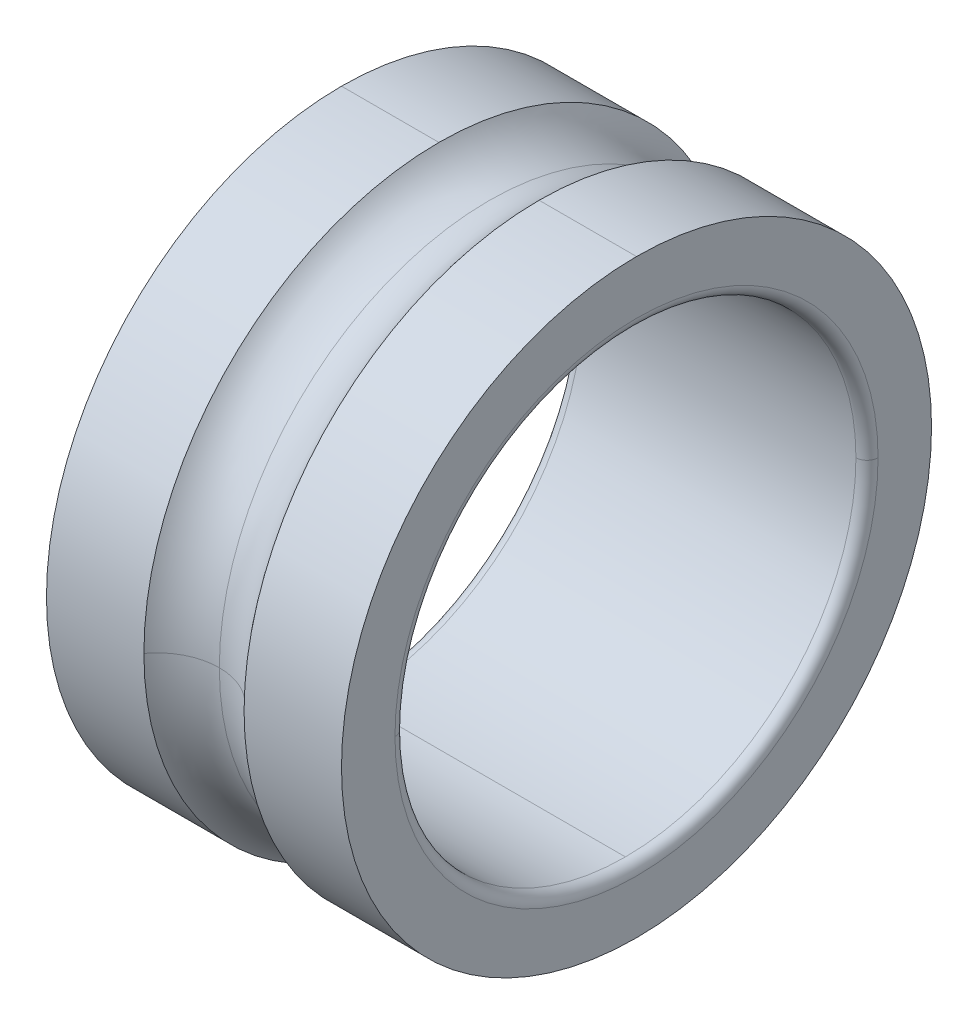
ISO-10303-21;
HEADER;
FILE_DESCRIPTION(('STEP AP214'),'2;1');
FILE_NAME('part.step','',(''),(''),'','','');
FILE_SCHEMA(('AUTOMOTIVE_DESIGN { 1 0 10303 214 1 1 1 1 }'));
ENDSEC;
DATA;
#1=APPLICATION_CONTEXT('core data for automotive mechanical design processes');
#2=APPLICATION_PROTOCOL_DEFINITION('international standard','automotive_design',2000,#1);
#3=PRODUCT_CONTEXT('',#1,'mechanical');
#4=PRODUCT('Part','Part','',(#3));
#5=PRODUCT_RELATED_PRODUCT_CATEGORY('part','',(#4));
#6=PRODUCT_DEFINITION_FORMATION('','',#4);
#7=PRODUCT_DEFINITION_CONTEXT('part definition',#1,'design');
#8=PRODUCT_DEFINITION('design','',#6,#7);
#9=PRODUCT_DEFINITION_SHAPE('','',#8);
#10=(LENGTH_UNIT() NAMED_UNIT(*) SI_UNIT(.MILLI.,.METRE.));
#11=(NAMED_UNIT(*) PLANE_ANGLE_UNIT() SI_UNIT($,.RADIAN.));
#12=(NAMED_UNIT(*) SI_UNIT($,.STERADIAN.) SOLID_ANGLE_UNIT());
#13=UNCERTAINTY_MEASURE_WITH_UNIT(LENGTH_MEASURE(1.E-05),#10,'distance_accuracy_value','');
#14=(GEOMETRIC_REPRESENTATION_CONTEXT(3) GLOBAL_UNCERTAINTY_ASSIGNED_CONTEXT((#13)) GLOBAL_UNIT_ASSIGNED_CONTEXT((#10,
#11,#12)) REPRESENTATION_CONTEXT('',''));
#15=CARTESIAN_POINT('',(0.,0.,0.));
#16=DIRECTION('',(0.,0.,1.));
#17=DIRECTION('',(1.,0.,0.));
#18=AXIS2_PLACEMENT_3D('',#15,#16,#17);
#19=CARTESIAN_POINT('',(13.3583539901292,0.,0.));
#20=DIRECTION('',(1.,0.,0.));
#21=DIRECTION('',(0.,1.,0.));
#22=AXIS2_PLACEMENT_3D('',#19,#20,#21);
#23=CYLINDRICAL_SURFACE('',#22,16.);
#24=DIRECTION('',(1.,0.,0.));
#25=VECTOR('',#24,1.);
#26=CARTESIAN_POINT('',(13.3583539901292,16.,0.));
#27=LINE('',#26,#25);
#28=CARTESIAN_POINT('',(10.7167079802585,16.,0.));
#29=VERTEX_POINT('',#28);
#30=CARTESIAN_POINT('',(16.,16.,0.));
#31=VERTEX_POINT('',#30);
#32=EDGE_CURVE('E149',#29,#31,#27,.T.);
#33=ORIENTED_EDGE('',*,*,#32,.T.);
#34=CARTESIAN_POINT('',(16.,0.,0.));
#35=DIRECTION('',(1.,0.,0.));
#36=DIRECTION('',(0.,1.,0.));
#37=AXIS2_PLACEMENT_3D('',#34,#35,#36);
#38=CIRCLE('',#37,16.);
#39=CARTESIAN_POINT('',(16.,-16.,0.));
#40=VERTEX_POINT('',#39);
#41=EDGE_CURVE('E211',#40,#31,#38,.T.);
#42=ORIENTED_EDGE('',*,*,#41,.F.);
#43=DIRECTION('',(-1.,0.,0.));
#44=VECTOR('',#43,1.);
#45=CARTESIAN_POINT('',(13.3583539901292,-16.,0.));
#46=LINE('',#45,#44);
#47=CARTESIAN_POINT('',(10.7167079802585,-16.,0.));
#48=VERTEX_POINT('',#47);
#49=EDGE_CURVE('E155',#40,#48,#46,.T.);
#50=ORIENTED_EDGE('',*,*,#49,.T.);
#51=CARTESIAN_POINT('',(10.7167079802585,0.,0.));
#52=DIRECTION('',(1.,0.,0.));
#53=DIRECTION('',(0.,1.,0.));
#54=AXIS2_PLACEMENT_3D('',#51,#52,#53);
#55=CIRCLE('',#54,16.);
#56=CARTESIAN_POINT('',(10.7167079802585,0.,-16.));
#57=VERTEX_POINT('',#56);
#58=EDGE_CURVE('E140',#48,#57,#55,.T.);
#59=ORIENTED_EDGE('',*,*,#58,.T.);
#60=CARTESIAN_POINT('',(10.7167079802585,0.,0.));
#61=DIRECTION('',(1.,0.,0.));
#62=DIRECTION('',(0.,1.,0.));
#63=AXIS2_PLACEMENT_3D('',#60,#61,#62);
#64=CIRCLE('',#63,16.);
#65=EDGE_CURVE('E146',#57,#29,#64,.T.);
#66=ORIENTED_EDGE('',*,*,#65,.T.);
#67=EDGE_LOOP('',(#33,#42,#50,#59,#66));
#68=FACE_BOUND('',#67,.T.);
#69=ADVANCED_FACE('F16',(#68),#23,.T.);
#70=CARTESIAN_POINT('',(8.,0.,0.));
#71=DIRECTION('',(1.,0.,0.));
#72=DIRECTION('',(0.,0.,-1.));
#73=AXIS2_PLACEMENT_3D('',#70,#71,#72);
#74=TOROIDAL_SURFACE('',#73,18.,3.3735);
#75=CARTESIAN_POINT('',(8.,0.,0.));
#76=DIRECTION('',(-1.,0.,0.));
#77=DIRECTION('',(0.,0.,1.));
#78=AXIS2_PLACEMENT_3D('',#75,#76,#77);
#79=CIRCLE('',#78,14.6265);
#80=CARTESIAN_POINT('',(8.,0.,14.6265));
#81=VERTEX_POINT('',#80);
#82=CARTESIAN_POINT('',(8.,0.,-14.6265));
#83=VERTEX_POINT('',#82);
#84=EDGE_CURVE('E133',#81,#83,#79,.T.);
#85=ORIENTED_EDGE('',*,*,#84,.T.);
#86=CARTESIAN_POINT('',(8.,0.,-18.));
#87=DIRECTION('',(0.,-1.,0.));
#88=DIRECTION('',(0.,0.,-1.));
#89=AXIS2_PLACEMENT_3D('',#86,#87,#88);
#90=CIRCLE('',#89,3.3735);
#91=CARTESIAN_POINT('',(5.28329201974154,0.,-16.));
#92=VERTEX_POINT('',#91);
#93=EDGE_CURVE('E127',#83,#92,#90,.T.);
#94=ORIENTED_EDGE('',*,*,#93,.T.);
#95=CARTESIAN_POINT('',(5.28329201974154,0.,0.));
#96=DIRECTION('',(1.,0.,0.));
#97=DIRECTION('',(0.,1.,0.));
#98=AXIS2_PLACEMENT_3D('',#95,#96,#97);
#99=CIRCLE('',#98,16.);
#100=CARTESIAN_POINT('',(5.28329201974154,16.,0.));
#101=VERTEX_POINT('',#100);
#102=EDGE_CURVE('E11',#92,#101,#99,.T.);
#103=ORIENTED_EDGE('',*,*,#102,.T.);
#104=CARTESIAN_POINT('',(5.28329201974154,0.,0.));
#105=DIRECTION('',(1.,0.,0.));
#106=DIRECTION('',(0.,1.,0.));
#107=AXIS2_PLACEMENT_3D('',#104,#105,#106);
#108=CIRCLE('',#107,16.);
#109=CARTESIAN_POINT('',(5.28329201974154,0.,16.));
#110=VERTEX_POINT('',#109);
#111=EDGE_CURVE('E126',#101,#110,#108,.T.);
#112=ORIENTED_EDGE('',*,*,#111,.T.);
#113=CARTESIAN_POINT('',(8.,0.,18.));
#114=DIRECTION('',(0.,-1.,0.));
#115=DIRECTION('',(0.,0.,1.));
#116=AXIS2_PLACEMENT_3D('',#113,#114,#115);
#117=CIRCLE('',#116,3.3735);
#118=EDGE_CURVE('E164',#110,#81,#117,.T.);
#119=ORIENTED_EDGE('',*,*,#118,.T.);
#120=EDGE_LOOP('',(#85,#94,#103,#112,#119));
#121=FACE_BOUND('',#120,.T.);
#122=ADVANCED_FACE('F259',(#121),#74,.F.);
#123=CARTESIAN_POINT('',(2.64164600987077,0.,0.));
#124=DIRECTION('',(1.,0.,0.));
#125=DIRECTION('',(0.,1.,0.));
#126=AXIS2_PLACEMENT_3D('',#123,#124,#125);
#127=CYLINDRICAL_SURFACE('',#126,16.);
#128=DIRECTION('',(1.,0.,0.));
#129=VECTOR('',#128,1.);
#130=CARTESIAN_POINT('',(2.64164600987077,16.,0.));
#131=LINE('',#130,#129);
#132=CARTESIAN_POINT('',(0.,16.,0.));
#133=VERTEX_POINT('',#132);
#134=EDGE_CURVE('E112',#133,#101,#131,.T.);
#135=ORIENTED_EDGE('',*,*,#134,.T.);
#136=ORIENTED_EDGE('',*,*,#102,.F.);
#137=CARTESIAN_POINT('',(5.28329201974154,0.,0.));
#138=DIRECTION('',(1.,0.,0.));
#139=DIRECTION('',(0.,1.,0.));
#140=AXIS2_PLACEMENT_3D('',#137,#138,#139);
#141=CIRCLE('',#140,16.);
#142=CARTESIAN_POINT('',(5.28329201974154,-16.,0.));
#143=VERTEX_POINT('',#142);
#144=EDGE_CURVE('E130',#143,#92,#141,.T.);
#145=ORIENTED_EDGE('',*,*,#144,.F.);
#146=DIRECTION('',(-1.,0.,0.));
#147=VECTOR('',#146,1.);
#148=CARTESIAN_POINT('',(2.64164600987077,-16.,0.));
#149=LINE('',#148,#147);
#150=CARTESIAN_POINT('',(0.,-16.,0.));
#151=VERTEX_POINT('',#150);
#152=EDGE_CURVE('E114',#143,#151,#149,.T.);
#153=ORIENTED_EDGE('',*,*,#152,.T.);
#154=CARTESIAN_POINT('',(0.,0.,0.));
#155=DIRECTION('',(1.,0.,0.));
#156=DIRECTION('',(0.,1.,0.));
#157=AXIS2_PLACEMENT_3D('',#154,#155,#156);
#158=CIRCLE('',#157,16.);
#159=EDGE_CURVE('E23',#151,#133,#158,.T.);
#160=ORIENTED_EDGE('',*,*,#159,.T.);
#161=EDGE_LOOP('',(#135,#136,#145,#153,#160));
#162=FACE_BOUND('',#161,.T.);
#163=ADVANCED_FACE('F110',(#162),#127,.T.);
#164=CARTESIAN_POINT('',(0.,14.55,0.));
#165=DIRECTION('',(-1.,0.,0.));
#166=DIRECTION('',(0.,0.,1.));
#167=AXIS2_PLACEMENT_3D('',#164,#165,#166);
#168=PLANE('',#167);
#169=CARTESIAN_POINT('',(0.,0.,0.));
#170=DIRECTION('',(1.,0.,0.));
#171=DIRECTION('',(0.,1.,0.));
#172=AXIS2_PLACEMENT_3D('',#169,#170,#171);
#173=CIRCLE('',#172,13.1);
#174=CARTESIAN_POINT('',(0.,0.,13.1));
#175=VERTEX_POINT('',#174);
#176=CARTESIAN_POINT('',(0.,0.,-13.1));
#177=VERTEX_POINT('',#176);
#178=EDGE_CURVE('E117',#175,#177,#173,.T.);
#179=ORIENTED_EDGE('',*,*,#178,.T.);
#180=CARTESIAN_POINT('',(0.,0.,0.));
#181=DIRECTION('',(1.,0.,0.));
#182=DIRECTION('',(0.,1.,0.));
#183=AXIS2_PLACEMENT_3D('',#180,#181,#182);
#184=CIRCLE('',#183,13.1);
#185=EDGE_CURVE('E190',#177,#175,#184,.T.);
#186=ORIENTED_EDGE('',*,*,#185,.T.);
#187=EDGE_LOOP('',(#179,#186));
#188=FACE_BOUND('',#187,.T.);
#189=CARTESIAN_POINT('',(0.,0.,0.));
#190=DIRECTION('',(1.,0.,0.));
#191=DIRECTION('',(0.,1.,0.));
#192=AXIS2_PLACEMENT_3D('',#189,#190,#191);
#193=CIRCLE('',#192,16.);
#194=EDGE_CURVE('E119',#133,#151,#193,.T.);
#195=ORIENTED_EDGE('',*,*,#194,.F.);
#196=ORIENTED_EDGE('',*,*,#159,.F.);
#197=EDGE_LOOP('',(#195,#196));
#198=FACE_BOUND('',#197,.T.);
#199=ADVANCED_FACE('F120',(#188,#198),#168,.T.);
#200=CARTESIAN_POINT('',(0.6,0.,0.));
#201=DIRECTION('',(1.,0.,0.));
#202=DIRECTION('',(0.,0.,-1.));
#203=AXIS2_PLACEMENT_3D('',#200,#201,#202);
#204=TOROIDAL_SURFACE('',#203,13.1,0.6);
#205=CARTESIAN_POINT('',(0.6,0.,-13.1));
#206=DIRECTION('',(0.,-1.,0.));
#207=DIRECTION('',(0.,0.,-1.));
#208=AXIS2_PLACEMENT_3D('',#205,#206,#207);
#209=CIRCLE('',#208,0.6);
#210=CARTESIAN_POINT('',(0.6,0.,-12.5));
#211=VERTEX_POINT('',#210);
#212=EDGE_CURVE('E178',#211,#177,#209,.T.);
#213=ORIENTED_EDGE('',*,*,#212,.T.);
#214=ORIENTED_EDGE('',*,*,#178,.F.);
#215=CARTESIAN_POINT('',(0.6,0.,13.1));
#216=DIRECTION('',(0.,-1.,0.));
#217=DIRECTION('',(0.,0.,1.));
#218=AXIS2_PLACEMENT_3D('',#215,#216,#217);
#219=CIRCLE('',#218,0.6);
#220=CARTESIAN_POINT('',(0.6,0.,12.5));
#221=VERTEX_POINT('',#220);
#222=EDGE_CURVE('E187',#175,#221,#219,.T.);
#223=ORIENTED_EDGE('',*,*,#222,.T.);
#224=CARTESIAN_POINT('',(0.6,0.,0.));
#225=DIRECTION('',(1.,0.,0.));
#226=DIRECTION('',(0.,1.,0.));
#227=AXIS2_PLACEMENT_3D('',#224,#225,#226);
#228=CIRCLE('',#227,12.5);
#229=CARTESIAN_POINT('',(0.6,-12.5,0.));
#230=VERTEX_POINT('',#229);
#231=EDGE_CURVE('E215',#221,#230,#228,.T.);
#232=ORIENTED_EDGE('',*,*,#231,.T.);
#233=CARTESIAN_POINT('',(0.6,0.,0.));
#234=DIRECTION('',(1.,0.,0.));
#235=DIRECTION('',(0.,1.,0.));
#236=AXIS2_PLACEMENT_3D('',#233,#234,#235);
#237=CIRCLE('',#236,12.5);
#238=EDGE_CURVE('E196',#230,#211,#237,.T.);
#239=ORIENTED_EDGE('',*,*,#238,.T.);
#240=EDGE_LOOP('',(#213,#214,#223,#232,#239));
#241=FACE_BOUND('',#240,.T.);
#242=ADVANCED_FACE('F223',(#241),#204,.T.);
#243=CARTESIAN_POINT('',(8.,0.,0.));
#244=DIRECTION('',(1.,0.,0.));
#245=DIRECTION('',(0.,1.,0.));
#246=AXIS2_PLACEMENT_3D('',#243,#244,#245);
#247=CYLINDRICAL_SURFACE('',#246,12.5);
#248=DIRECTION('',(1.,0.,0.));
#249=VECTOR('',#248,1.);
#250=CARTESIAN_POINT('',(8.,12.5,0.));
#251=LINE('',#250,#249);
#252=CARTESIAN_POINT('',(0.6,12.5,0.));
#253=VERTEX_POINT('',#252);
#254=CARTESIAN_POINT('',(15.4,12.5,0.));
#255=VERTEX_POINT('',#254);
#256=EDGE_CURVE('E193',#253,#255,#251,.T.);
#257=ORIENTED_EDGE('',*,*,#256,.T.);
#258=CARTESIAN_POINT('',(15.4,0.,0.));
#259=DIRECTION('',(1.,0.,0.));
#260=DIRECTION('',(0.,1.,0.));
#261=AXIS2_PLACEMENT_3D('',#258,#259,#260);
#262=CIRCLE('',#261,12.5);
#263=CARTESIAN_POINT('',(15.4,0.,12.5));
#264=VERTEX_POINT('',#263);
#265=EDGE_CURVE('E209',#255,#264,#262,.T.);
#266=ORIENTED_EDGE('',*,*,#265,.T.);
#267=CARTESIAN_POINT('',(15.4,0.,0.));
#268=DIRECTION('',(1.,0.,0.));
#269=DIRECTION('',(0.,1.,0.));
#270=AXIS2_PLACEMENT_3D('',#267,#268,#269);
#271=CIRCLE('',#270,12.5);
#272=CARTESIAN_POINT('',(15.4,-12.5,0.));
#273=VERTEX_POINT('',#272);
#274=EDGE_CURVE('E30',#264,#273,#271,.T.);
#275=ORIENTED_EDGE('',*,*,#274,.T.);
#276=DIRECTION('',(-1.,0.,0.));
#277=VECTOR('',#276,1.);
#278=CARTESIAN_POINT('',(8.,-12.5,0.));
#279=LINE('',#278,#277);
#280=EDGE_CURVE('E198',#273,#230,#279,.T.);
#281=ORIENTED_EDGE('',*,*,#280,.T.);
#282=ORIENTED_EDGE('',*,*,#231,.F.);
#283=CARTESIAN_POINT('',(0.6,0.,0.));
#284=DIRECTION('',(1.,0.,0.));
#285=DIRECTION('',(0.,1.,0.));
#286=AXIS2_PLACEMENT_3D('',#283,#284,#285);
#287=CIRCLE('',#286,12.5);
#288=EDGE_CURVE('E184',#253,#221,#287,.T.);
#289=ORIENTED_EDGE('',*,*,#288,.F.);
#290=EDGE_LOOP('',(#257,#266,#275,#281,#282,#289));
#291=FACE_BOUND('',#290,.T.);
#292=ADVANCED_FACE('F231',(#291),#247,.F.);
#293=CARTESIAN_POINT('',(15.4,0.,0.));
#294=DIRECTION('',(1.,0.,0.));
#295=DIRECTION('',(0.,0.,-1.));
#296=AXIS2_PLACEMENT_3D('',#293,#294,#295);
#297=TOROIDAL_SURFACE('',#296,13.1,0.6);
#298=CARTESIAN_POINT('',(15.4,0.,-13.1));
#299=DIRECTION('',(0.,-1.,0.));
#300=DIRECTION('',(0.,0.,-1.));
#301=AXIS2_PLACEMENT_3D('',#298,#299,#300);
#302=CIRCLE('',#301,0.6);
#303=CARTESIAN_POINT('',(16.,0.,-13.1));
#304=VERTEX_POINT('',#303);
#305=CARTESIAN_POINT('',(15.4,0.,-12.5));
#306=VERTEX_POINT('',#305);
#307=EDGE_CURVE('E169',#304,#306,#302,.T.);
#308=ORIENTED_EDGE('',*,*,#307,.T.);
#309=CARTESIAN_POINT('',(15.4,0.,0.));
#310=DIRECTION('',(1.,0.,0.));
#311=DIRECTION('',(0.,1.,0.));
#312=AXIS2_PLACEMENT_3D('',#309,#310,#311);
#313=CIRCLE('',#312,12.5);
#314=EDGE_CURVE('E201',#273,#306,#313,.T.);
#315=ORIENTED_EDGE('',*,*,#314,.F.);
#316=ORIENTED_EDGE('',*,*,#274,.F.);
#317=CARTESIAN_POINT('',(15.4,0.,13.1));
#318=DIRECTION('',(0.,-1.,0.));
#319=DIRECTION('',(0.,0.,1.));
#320=AXIS2_PLACEMENT_3D('',#317,#318,#319);
#321=CIRCLE('',#320,0.6);
#322=CARTESIAN_POINT('',(16.,0.,13.1));
#323=VERTEX_POINT('',#322);
#324=EDGE_CURVE('E168',#264,#323,#321,.T.);
#325=ORIENTED_EDGE('',*,*,#324,.T.);
#326=CARTESIAN_POINT('',(16.,0.,0.));
#327=DIRECTION('',(1.,0.,0.));
#328=DIRECTION('',(0.,1.,0.));
#329=AXIS2_PLACEMENT_3D('',#326,#327,#328);
#330=CIRCLE('',#329,13.1);
#331=EDGE_CURVE('E37',#323,#304,#330,.T.);
#332=ORIENTED_EDGE('',*,*,#331,.T.);
#333=EDGE_LOOP('',(#308,#315,#316,#325,#332));
#334=FACE_BOUND('',#333,.T.);
#335=ADVANCED_FACE('F233',(#334),#297,.T.);
#336=CARTESIAN_POINT('',(16.,14.55,0.));
#337=DIRECTION('',(1.,0.,0.));
#338=DIRECTION('',(0.,1.,0.));
#339=AXIS2_PLACEMENT_3D('',#336,#337,#338);
#340=PLANE('',#339);
#341=CARTESIAN_POINT('',(16.,0.,0.));
#342=DIRECTION('',(1.,0.,0.));
#343=DIRECTION('',(0.,1.,0.));
#344=AXIS2_PLACEMENT_3D('',#341,#342,#343);
#345=CIRCLE('',#344,13.1);
#346=EDGE_CURVE('E165',#304,#323,#345,.T.);
#347=ORIENTED_EDGE('',*,*,#346,.F.);
#348=ORIENTED_EDGE('',*,*,#331,.F.);
#349=EDGE_LOOP('',(#347,#348));
#350=FACE_BOUND('',#349,.T.);
#351=CARTESIAN_POINT('',(16.,0.,0.));
#352=DIRECTION('',(1.,0.,0.));
#353=DIRECTION('',(0.,1.,0.));
#354=AXIS2_PLACEMENT_3D('',#351,#352,#353);
#355=CIRCLE('',#354,16.);
#356=EDGE_CURVE('E157',#31,#40,#355,.T.);
#357=ORIENTED_EDGE('',*,*,#356,.T.);
#358=ORIENTED_EDGE('',*,*,#41,.T.);
#359=EDGE_LOOP('',(#357,#358));
#360=FACE_BOUND('',#359,.T.);
#361=ADVANCED_FACE('F238',(#350,#360),#340,.T.);
#362=CARTESIAN_POINT('',(15.4,0.,0.));
#363=DIRECTION('',(1.,0.,0.));
#364=DIRECTION('',(0.,0.,-1.));
#365=AXIS2_PLACEMENT_3D('',#362,#363,#364);
#366=TOROIDAL_SURFACE('',#365,13.1,0.6);
#367=ORIENTED_EDGE('',*,*,#307,.F.);
#368=ORIENTED_EDGE('',*,*,#346,.T.);
#369=ORIENTED_EDGE('',*,*,#324,.F.);
#370=ORIENTED_EDGE('',*,*,#265,.F.);
#371=CARTESIAN_POINT('',(15.4,0.,0.));
#372=DIRECTION('',(1.,0.,0.));
#373=DIRECTION('',(0.,1.,0.));
#374=AXIS2_PLACEMENT_3D('',#371,#372,#373);
#375=CIRCLE('',#374,12.5);
#376=EDGE_CURVE('E204',#306,#255,#375,.T.);
#377=ORIENTED_EDGE('',*,*,#376,.F.);
#378=EDGE_LOOP('',(#367,#368,#369,#370,#377));
#379=FACE_BOUND('',#378,.T.);
#380=ADVANCED_FACE('F236',(#379),#366,.T.);
#381=CARTESIAN_POINT('',(8.,0.,0.));
#382=DIRECTION('',(1.,0.,0.));
#383=DIRECTION('',(0.,1.,0.));
#384=AXIS2_PLACEMENT_3D('',#381,#382,#383);
#385=CYLINDRICAL_SURFACE('',#384,12.5);
#386=ORIENTED_EDGE('',*,*,#256,.F.);
#387=CARTESIAN_POINT('',(0.6,0.,0.));
#388=DIRECTION('',(1.,0.,0.));
#389=DIRECTION('',(0.,1.,0.));
#390=AXIS2_PLACEMENT_3D('',#387,#388,#389);
#391=CIRCLE('',#390,12.5);
#392=EDGE_CURVE('E181',#211,#253,#391,.T.);
#393=ORIENTED_EDGE('',*,*,#392,.F.);
#394=ORIENTED_EDGE('',*,*,#238,.F.);
#395=ORIENTED_EDGE('',*,*,#280,.F.);
#396=ORIENTED_EDGE('',*,*,#314,.T.);
#397=ORIENTED_EDGE('',*,*,#376,.T.);
#398=EDGE_LOOP('',(#386,#393,#394,#395,#396,#397));
#399=FACE_BOUND('',#398,.T.);
#400=ADVANCED_FACE('F228',(#399),#385,.F.);
#401=CARTESIAN_POINT('',(0.6,0.,0.));
#402=DIRECTION('',(1.,0.,0.));
#403=DIRECTION('',(0.,0.,-1.));
#404=AXIS2_PLACEMENT_3D('',#401,#402,#403);
#405=TOROIDAL_SURFACE('',#404,13.1,0.6);
#406=ORIENTED_EDGE('',*,*,#212,.F.);
#407=ORIENTED_EDGE('',*,*,#392,.T.);
#408=ORIENTED_EDGE('',*,*,#288,.T.);
#409=ORIENTED_EDGE('',*,*,#222,.F.);
#410=ORIENTED_EDGE('',*,*,#185,.F.);
#411=EDGE_LOOP('',(#406,#407,#408,#409,#410));
#412=FACE_BOUND('',#411,.T.);
#413=ADVANCED_FACE('F222',(#412),#405,.T.);
#414=CARTESIAN_POINT('',(2.64164600987077,0.,0.));
#415=DIRECTION('',(1.,0.,0.));
#416=DIRECTION('',(0.,1.,0.));
#417=AXIS2_PLACEMENT_3D('',#414,#415,#416);
#418=CYLINDRICAL_SURFACE('',#417,16.);
#419=ORIENTED_EDGE('',*,*,#134,.F.);
#420=ORIENTED_EDGE('',*,*,#194,.T.);
#421=ORIENTED_EDGE('',*,*,#152,.F.);
#422=CARTESIAN_POINT('',(5.28329201974154,0.,0.));
#423=DIRECTION('',(1.,0.,0.));
#424=DIRECTION('',(0.,1.,0.));
#425=AXIS2_PLACEMENT_3D('',#422,#423,#424);
#426=CIRCLE('',#425,16.);
#427=EDGE_CURVE('E171',#110,#143,#426,.T.);
#428=ORIENTED_EDGE('',*,*,#427,.F.);
#429=ORIENTED_EDGE('',*,*,#111,.F.);
#430=EDGE_LOOP('',(#419,#420,#421,#428,#429));
#431=FACE_BOUND('',#430,.T.);
#432=ADVANCED_FACE('F124',(#431),#418,.T.);
#433=CARTESIAN_POINT('',(8.,0.,0.));
#434=DIRECTION('',(1.,0.,0.));
#435=DIRECTION('',(0.,0.,-1.));
#436=AXIS2_PLACEMENT_3D('',#433,#434,#435);
#437=TOROIDAL_SURFACE('',#436,18.,3.3735);
#438=CARTESIAN_POINT('',(8.,0.,0.));
#439=DIRECTION('',(-1.,0.,0.));
#440=DIRECTION('',(0.,0.,1.));
#441=AXIS2_PLACEMENT_3D('',#438,#439,#440);
#442=CIRCLE('',#441,14.6265);
#443=EDGE_CURVE('E143',#83,#81,#442,.T.);
#444=ORIENTED_EDGE('',*,*,#443,.T.);
#445=ORIENTED_EDGE('',*,*,#118,.F.);
#446=ORIENTED_EDGE('',*,*,#427,.T.);
#447=ORIENTED_EDGE('',*,*,#144,.T.);
#448=ORIENTED_EDGE('',*,*,#93,.F.);
#449=EDGE_LOOP('',(#444,#445,#446,#447,#448));
#450=FACE_BOUND('',#449,.T.);
#451=ADVANCED_FACE('F262',(#450),#437,.F.);
#452=CARTESIAN_POINT('',(13.3583539901292,0.,0.));
#453=DIRECTION('',(1.,0.,0.));
#454=DIRECTION('',(0.,1.,0.));
#455=AXIS2_PLACEMENT_3D('',#452,#453,#454);
#456=CYLINDRICAL_SURFACE('',#455,16.);
#457=ORIENTED_EDGE('',*,*,#32,.F.);
#458=CARTESIAN_POINT('',(10.7167079802585,0.,0.));
#459=DIRECTION('',(1.,0.,0.));
#460=DIRECTION('',(0.,1.,0.));
#461=AXIS2_PLACEMENT_3D('',#458,#459,#460);
#462=CIRCLE('',#461,16.);
#463=CARTESIAN_POINT('',(10.7167079802585,0.,16.));
#464=VERTEX_POINT('',#463);
#465=EDGE_CURVE('E139',#29,#464,#462,.T.);
#466=ORIENTED_EDGE('',*,*,#465,.T.);
#467=CARTESIAN_POINT('',(10.7167079802585,0.,0.));
#468=DIRECTION('',(1.,0.,0.));
#469=DIRECTION('',(0.,1.,0.));
#470=AXIS2_PLACEMENT_3D('',#467,#468,#469);
#471=CIRCLE('',#470,16.);
#472=EDGE_CURVE('E142',#464,#48,#471,.T.);
#473=ORIENTED_EDGE('',*,*,#472,.T.);
#474=ORIENTED_EDGE('',*,*,#49,.F.);
#475=ORIENTED_EDGE('',*,*,#356,.F.);
#476=EDGE_LOOP('',(#457,#466,#473,#474,#475));
#477=FACE_BOUND('',#476,.T.);
#478=ADVANCED_FACE('F245',(#477),#456,.T.);
#479=CARTESIAN_POINT('',(8.,0.,0.));
#480=DIRECTION('',(1.,0.,0.));
#481=DIRECTION('',(0.,0.,-1.));
#482=AXIS2_PLACEMENT_3D('',#479,#480,#481);
#483=TOROIDAL_SURFACE('',#482,18.,3.3735);
#484=ORIENTED_EDGE('',*,*,#443,.F.);
#485=CARTESIAN_POINT('',(8.,0.,-18.));
#486=DIRECTION('',(0.,-1.,0.));
#487=DIRECTION('',(0.,0.,-1.));
#488=AXIS2_PLACEMENT_3D('',#485,#486,#487);
#489=CIRCLE('',#488,3.3735);
#490=EDGE_CURVE('E152',#57,#83,#489,.T.);
#491=ORIENTED_EDGE('',*,*,#490,.F.);
#492=ORIENTED_EDGE('',*,*,#58,.F.);
#493=ORIENTED_EDGE('',*,*,#472,.F.);
#494=CARTESIAN_POINT('',(8.,0.,18.));
#495=DIRECTION('',(0.,-1.,0.));
#496=DIRECTION('',(0.,0.,1.));
#497=AXIS2_PLACEMENT_3D('',#494,#495,#496);
#498=CIRCLE('',#497,3.3735);
#499=EDGE_CURVE('E136',#81,#464,#498,.T.);
#500=ORIENTED_EDGE('',*,*,#499,.F.);
#501=EDGE_LOOP('',(#484,#491,#492,#493,#500));
#502=FACE_BOUND('',#501,.T.);
#503=ADVANCED_FACE('F257',(#502),#483,.F.);
#504=CARTESIAN_POINT('',(8.,0.,0.));
#505=DIRECTION('',(1.,0.,0.));
#506=DIRECTION('',(0.,0.,-1.));
#507=AXIS2_PLACEMENT_3D('',#504,#505,#506);
#508=TOROIDAL_SURFACE('',#507,18.,3.3735);
#509=ORIENTED_EDGE('',*,*,#84,.F.);
#510=ORIENTED_EDGE('',*,*,#499,.T.);
#511=ORIENTED_EDGE('',*,*,#465,.F.);
#512=ORIENTED_EDGE('',*,*,#65,.F.);
#513=ORIENTED_EDGE('',*,*,#490,.T.);
#514=EDGE_LOOP('',(#509,#510,#511,#512,#513));
#515=FACE_BOUND('',#514,.T.);
#516=ADVANCED_FACE('F254',(#515),#508,.F.);
#517=CLOSED_SHELL('',(#69,#122,#163,#199,#242,#292,#335,#361,#380,#400,#413,#432,#451,#478,#503,#516));
#518=MANIFOLD_SOLID_BREP('B1',#517);
#519=ADVANCED_BREP_SHAPE_REPRESENTATION('',(#18,#518),#14);
#520=SHAPE_DEFINITION_REPRESENTATION(#9,#519);
ENDSEC;
END-ISO-10303-21;
